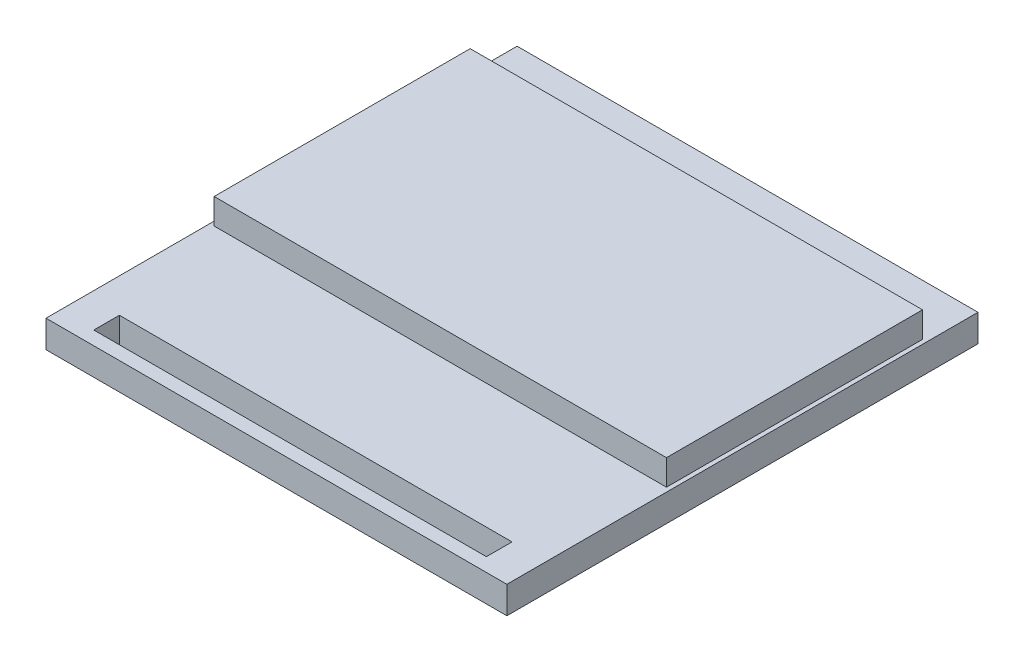
ISO-10303-21;
HEADER;
FILE_DESCRIPTION(('STEP AP214'),'2;1');
FILE_NAME('part.step','',(''),(''),'','','');
FILE_SCHEMA(('AUTOMOTIVE_DESIGN { 1 0 10303 214 1 1 1 1 }'));
ENDSEC;
DATA;
#1=APPLICATION_CONTEXT('core data for automotive mechanical design processes');
#2=APPLICATION_PROTOCOL_DEFINITION('international standard','automotive_design',2000,#1);
#3=PRODUCT_CONTEXT('',#1,'mechanical');
#4=PRODUCT('Part','Part','',(#3));
#5=PRODUCT_RELATED_PRODUCT_CATEGORY('part','',(#4));
#6=PRODUCT_DEFINITION_FORMATION('','',#4);
#7=PRODUCT_DEFINITION_CONTEXT('part definition',#1,'design');
#8=PRODUCT_DEFINITION('design','',#6,#7);
#9=PRODUCT_DEFINITION_SHAPE('','',#8);
#10=(LENGTH_UNIT() NAMED_UNIT(*) SI_UNIT(.MILLI.,.METRE.));
#11=(NAMED_UNIT(*) PLANE_ANGLE_UNIT() SI_UNIT($,.RADIAN.));
#12=(NAMED_UNIT(*) SI_UNIT($,.STERADIAN.) SOLID_ANGLE_UNIT());
#13=UNCERTAINTY_MEASURE_WITH_UNIT(LENGTH_MEASURE(1.E-05),#10,'distance_accuracy_value','');
#14=(GEOMETRIC_REPRESENTATION_CONTEXT(3) GLOBAL_UNCERTAINTY_ASSIGNED_CONTEXT((#13)) GLOBAL_UNIT_ASSIGNED_CONTEXT((#10,
#11,#12)) REPRESENTATION_CONTEXT('',''));
#15=CARTESIAN_POINT('',(0.,0.,0.));
#16=DIRECTION('',(0.,0.,1.));
#17=DIRECTION('',(1.,0.,0.));
#18=AXIS2_PLACEMENT_3D('',#15,#16,#17);
#19=CARTESIAN_POINT('',(0.,0.,0.));
#20=DIRECTION('',(0.,1.,0.));
#21=DIRECTION('',(0.,0.,1.));
#22=AXIS2_PLACEMENT_3D('',#19,#20,#21);
#23=PLANE('',#22);
#24=DIRECTION('',(0.,0.,-1.));
#25=VECTOR('',#24,1.);
#26=CARTESIAN_POINT('',(0.5,0.,0.6));
#27=LINE('',#26,#25);
#28=CARTESIAN_POINT('',(0.499999999999997,0.,13.2));
#29=VERTEX_POINT('',#28);
#30=CARTESIAN_POINT('',(0.5,0.,0.6));
#31=VERTEX_POINT('',#30);
#32=EDGE_CURVE('E191',#29,#31,#27,.T.);
#33=ORIENTED_EDGE('',*,*,#32,.F.);
#34=DIRECTION('',(-1.,0.,0.));
#35=VECTOR('',#34,1.);
#36=CARTESIAN_POINT('',(0.499999999999997,0.,13.2));
#37=LINE('',#36,#35);
#38=CARTESIAN_POINT('',(6.1,0.,13.2));
#39=VERTEX_POINT('',#38);
#40=EDGE_CURVE('E203',#39,#29,#37,.T.);
#41=ORIENTED_EDGE('',*,*,#40,.F.);
#42=DIRECTION('',(0.,0.,1.));
#43=VECTOR('',#42,1.);
#44=CARTESIAN_POINT('',(6.1,0.,0.6));
#45=LINE('',#44,#43);
#46=CARTESIAN_POINT('',(6.1,0.,0.6));
#47=VERTEX_POINT('',#46);
#48=EDGE_CURVE('E211',#47,#39,#45,.T.);
#49=ORIENTED_EDGE('',*,*,#48,.F.);
#50=DIRECTION('',(1.,0.,0.));
#51=VECTOR('',#50,1.);
#52=CARTESIAN_POINT('',(0.5,0.,0.6));
#53=LINE('',#52,#51);
#54=EDGE_CURVE('E56',#31,#47,#53,.T.);
#55=ORIENTED_EDGE('',*,*,#54,.F.);
#56=EDGE_LOOP('',(#33,#41,#49,#55));
#57=FACE_BOUND('',#56,.T.);
#58=DIRECTION('',(0.,0.,1.));
#59=VECTOR('',#58,1.);
#60=CARTESIAN_POINT('',(2.,0.,26.8));
#61=LINE('',#60,#59);
#62=CARTESIAN_POINT('',(2.,0.,25.3));
#63=VERTEX_POINT('',#62);
#64=CARTESIAN_POINT('',(2.,0.,26.8));
#65=VERTEX_POINT('',#64);
#66=EDGE_CURVE('E259',#63,#65,#61,.T.);
#67=ORIENTED_EDGE('',*,*,#66,.T.);
#68=DIRECTION('',(1.,0.,0.));
#69=VECTOR('',#68,1.);
#70=CARTESIAN_POINT('',(2.,0.,26.8));
#71=LINE('',#70,#69);
#72=CARTESIAN_POINT('',(25.,0.,26.8));
#73=VERTEX_POINT('',#72);
#74=EDGE_CURVE('E273',#65,#73,#71,.T.);
#75=ORIENTED_EDGE('',*,*,#74,.T.);
#76=DIRECTION('',(0.,0.,-1.));
#77=VECTOR('',#76,1.);
#78=CARTESIAN_POINT('',(25.,0.,26.8));
#79=LINE('',#78,#77);
#80=CARTESIAN_POINT('',(25.,0.,25.3));
#81=VERTEX_POINT('',#80);
#82=EDGE_CURVE('E276',#73,#81,#79,.T.);
#83=ORIENTED_EDGE('',*,*,#82,.T.);
#84=DIRECTION('',(-1.,0.,0.));
#85=VECTOR('',#84,1.);
#86=CARTESIAN_POINT('',(2.,0.,25.3));
#87=LINE('',#86,#85);
#88=EDGE_CURVE('E263',#81,#63,#87,.T.);
#89=ORIENTED_EDGE('',*,*,#88,.T.);
#90=EDGE_LOOP('',(#67,#75,#83,#89));
#91=FACE_BOUND('',#90,.T.);
#92=DIRECTION('',(0.,0.,-1.));
#93=VECTOR('',#92,1.);
#94=CARTESIAN_POINT('',(8.4,0.,0.));
#95=LINE('',#94,#93);
#96=CARTESIAN_POINT('',(8.4,0.,2.5));
#97=VERTEX_POINT('',#96);
#98=CARTESIAN_POINT('',(8.4,0.,0.));
#99=VERTEX_POINT('',#98);
#100=EDGE_CURVE('E48',#97,#99,#95,.T.);
#101=ORIENTED_EDGE('',*,*,#100,.F.);
#102=DIRECTION('',(-1.,0.,0.));
#103=VECTOR('',#102,1.);
#104=CARTESIAN_POINT('',(8.4,0.,2.5));
#105=LINE('',#104,#103);
#106=CARTESIAN_POINT('',(18.6,0.,2.5));
#107=VERTEX_POINT('',#106);
#108=EDGE_CURVE('E188',#107,#97,#105,.T.);
#109=ORIENTED_EDGE('',*,*,#108,.F.);
#110=DIRECTION('',(0.,0.,1.));
#111=VECTOR('',#110,1.);
#112=CARTESIAN_POINT('',(18.6,0.,0.));
#113=LINE('',#112,#111);
#114=CARTESIAN_POINT('',(18.6,0.,0.));
#115=VERTEX_POINT('',#114);
#116=EDGE_CURVE('E327',#115,#107,#113,.T.);
#117=ORIENTED_EDGE('',*,*,#116,.F.);
#118=DIRECTION('',(-1.,0.,0.));
#119=VECTOR('',#118,1.);
#120=CARTESIAN_POINT('',(0.,0.,0.));
#121=LINE('',#120,#119);
#122=CARTESIAN_POINT('',(27.,0.,0.));
#123=VERTEX_POINT('',#122);
#124=EDGE_CURVE('E295',#123,#115,#121,.T.);
#125=ORIENTED_EDGE('',*,*,#124,.F.);
#126=DIRECTION('',(0.,0.,-1.));
#127=VECTOR('',#126,1.);
#128=CARTESIAN_POINT('',(27.,0.,0.));
#129=LINE('',#128,#127);
#130=CARTESIAN_POINT('',(27.,0.,27.6));
#131=VERTEX_POINT('',#130);
#132=EDGE_CURVE('E306',#131,#123,#129,.T.);
#133=ORIENTED_EDGE('',*,*,#132,.F.);
#134=DIRECTION('',(1.,0.,0.));
#135=VECTOR('',#134,1.);
#136=CARTESIAN_POINT('',(0.,0.,27.6));
#137=LINE('',#136,#135);
#138=CARTESIAN_POINT('',(0.,0.,27.6));
#139=VERTEX_POINT('',#138);
#140=EDGE_CURVE('E304',#139,#131,#137,.T.);
#141=ORIENTED_EDGE('',*,*,#140,.F.);
#142=DIRECTION('',(0.,0.,1.));
#143=VECTOR('',#142,1.);
#144=CARTESIAN_POINT('',(0.,0.,0.));
#145=LINE('',#144,#143);
#146=CARTESIAN_POINT('',(0.,0.,0.));
#147=VERTEX_POINT('',#146);
#148=EDGE_CURVE('E290',#147,#139,#145,.T.);
#149=ORIENTED_EDGE('',*,*,#148,.F.);
#150=EDGE_CURVE('E308',#99,#147,#121,.T.);
#151=ORIENTED_EDGE('',*,*,#150,.F.);
#152=EDGE_LOOP('',(#101,#109,#117,#125,#133,#141,#149,#151));
#153=FACE_BOUND('',#152,.T.);
#154=ADVANCED_FACE('F33',(#57,#91,#153),#23,.F.);
#155=CARTESIAN_POINT('',(0.,1.6,0.));
#156=DIRECTION('',(0.,1.,0.));
#157=DIRECTION('',(0.,0.,1.));
#158=AXIS2_PLACEMENT_3D('',#155,#156,#157);
#159=PLANE('',#158);
#160=DIRECTION('',(0.,0.,1.));
#161=VECTOR('',#160,1.);
#162=CARTESIAN_POINT('',(0.25,1.6,3.));
#163=LINE('',#162,#161);
#164=CARTESIAN_POINT('',(0.25,1.6,3.));
#165=VERTEX_POINT('',#164);
#166=CARTESIAN_POINT('',(0.250000000000002,1.6,18.));
#167=VERTEX_POINT('',#166);
#168=EDGE_CURVE('E226',#165,#167,#163,.T.);
#169=ORIENTED_EDGE('',*,*,#168,.F.);
#170=DIRECTION('',(-1.,0.,0.));
#171=VECTOR('',#170,1.);
#172=CARTESIAN_POINT('',(0.25,1.6,3.));
#173=LINE('',#172,#171);
#174=CARTESIAN_POINT('',(26.75,1.6,3.));
#175=VERTEX_POINT('',#174);
#176=EDGE_CURVE('E231',#175,#165,#173,.T.);
#177=ORIENTED_EDGE('',*,*,#176,.F.);
#178=DIRECTION('',(0.,0.,-1.));
#179=VECTOR('',#178,1.);
#180=CARTESIAN_POINT('',(26.75,1.6,3.));
#181=LINE('',#180,#179);
#182=CARTESIAN_POINT('',(26.75,1.6,18.));
#183=VERTEX_POINT('',#182);
#184=EDGE_CURVE('E243',#183,#175,#181,.T.);
#185=ORIENTED_EDGE('',*,*,#184,.F.);
#186=DIRECTION('',(1.,0.,0.));
#187=VECTOR('',#186,1.);
#188=CARTESIAN_POINT('',(0.250000000000002,1.6,18.));
#189=LINE('',#188,#187);
#190=EDGE_CURVE('E240',#167,#183,#189,.T.);
#191=ORIENTED_EDGE('',*,*,#190,.F.);
#192=EDGE_LOOP('',(#169,#177,#185,#191));
#193=FACE_BOUND('',#192,.T.);
#194=DIRECTION('',(0.,0.,1.));
#195=VECTOR('',#194,1.);
#196=CARTESIAN_POINT('',(0.,1.6,0.));
#197=LINE('',#196,#195);
#198=CARTESIAN_POINT('',(0.,1.6,0.));
#199=VERTEX_POINT('',#198);
#200=CARTESIAN_POINT('',(0.,1.6,27.6));
#201=VERTEX_POINT('',#200);
#202=EDGE_CURVE('E291',#199,#201,#197,.T.);
#203=ORIENTED_EDGE('',*,*,#202,.T.);
#204=DIRECTION('',(1.,0.,0.));
#205=VECTOR('',#204,1.);
#206=CARTESIAN_POINT('',(0.,1.6,27.6));
#207=LINE('',#206,#205);
#208=CARTESIAN_POINT('',(27.,1.6,27.6));
#209=VERTEX_POINT('',#208);
#210=EDGE_CURVE('E294',#201,#209,#207,.T.);
#211=ORIENTED_EDGE('',*,*,#210,.T.);
#212=DIRECTION('',(0.,0.,-1.));
#213=VECTOR('',#212,1.);
#214=CARTESIAN_POINT('',(27.,1.6,0.));
#215=LINE('',#214,#213);
#216=CARTESIAN_POINT('',(27.,1.6,0.));
#217=VERTEX_POINT('',#216);
#218=EDGE_CURVE('E297',#209,#217,#215,.T.);
#219=ORIENTED_EDGE('',*,*,#218,.T.);
#220=DIRECTION('',(-1.,0.,0.));
#221=VECTOR('',#220,1.);
#222=CARTESIAN_POINT('',(0.,1.6,0.));
#223=LINE('',#222,#221);
#224=EDGE_CURVE('E299',#217,#199,#223,.T.);
#225=ORIENTED_EDGE('',*,*,#224,.T.);
#226=EDGE_LOOP('',(#203,#211,#219,#225));
#227=FACE_BOUND('',#226,.T.);
#228=DIRECTION('',(1.,0.,0.));
#229=VECTOR('',#228,1.);
#230=CARTESIAN_POINT('',(2.,1.6,26.8));
#231=LINE('',#230,#229);
#232=CARTESIAN_POINT('',(2.,1.6,26.8));
#233=VERTEX_POINT('',#232);
#234=CARTESIAN_POINT('',(25.,1.6,26.8));
#235=VERTEX_POINT('',#234);
#236=EDGE_CURVE('E262',#233,#235,#231,.T.);
#237=ORIENTED_EDGE('',*,*,#236,.F.);
#238=DIRECTION('',(0.,0.,1.));
#239=VECTOR('',#238,1.);
#240=CARTESIAN_POINT('',(2.,1.6,26.8));
#241=LINE('',#240,#239);
#242=CARTESIAN_POINT('',(2.,1.6,25.3));
#243=VERTEX_POINT('',#242);
#244=EDGE_CURVE('E260',#243,#233,#241,.T.);
#245=ORIENTED_EDGE('',*,*,#244,.F.);
#246=DIRECTION('',(-1.,0.,0.));
#247=VECTOR('',#246,1.);
#248=CARTESIAN_POINT('',(2.,1.6,25.3));
#249=LINE('',#248,#247);
#250=CARTESIAN_POINT('',(25.,1.6,25.3));
#251=VERTEX_POINT('',#250);
#252=EDGE_CURVE('E268',#251,#243,#249,.T.);
#253=ORIENTED_EDGE('',*,*,#252,.F.);
#254=DIRECTION('',(0.,0.,-1.));
#255=VECTOR('',#254,1.);
#256=CARTESIAN_POINT('',(25.,1.6,26.8));
#257=LINE('',#256,#255);
#258=EDGE_CURVE('E265',#235,#251,#257,.T.);
#259=ORIENTED_EDGE('',*,*,#258,.F.);
#260=EDGE_LOOP('',(#237,#245,#253,#259));
#261=FACE_BOUND('',#260,.T.);
#262=ADVANCED_FACE('F332',(#193,#227,#261),#159,.T.);
#263=CARTESIAN_POINT('',(0.,1.6,0.));
#264=DIRECTION('',(1.,0.,0.));
#265=DIRECTION('',(0.,0.,-1.));
#266=AXIS2_PLACEMENT_3D('',#263,#264,#265);
#267=PLANE('',#266);
#268=ORIENTED_EDGE('',*,*,#148,.T.);
#269=DIRECTION('',(0.,-1.,0.));
#270=VECTOR('',#269,1.);
#271=CARTESIAN_POINT('',(0.,1.6,27.6));
#272=LINE('',#271,#270);
#273=EDGE_CURVE('E11',#201,#139,#272,.T.);
#274=ORIENTED_EDGE('',*,*,#273,.F.);
#275=ORIENTED_EDGE('',*,*,#202,.F.);
#276=DIRECTION('',(0.,-1.,0.));
#277=VECTOR('',#276,1.);
#278=CARTESIAN_POINT('',(0.,1.6,0.));
#279=LINE('',#278,#277);
#280=EDGE_CURVE('E301',#199,#147,#279,.T.);
#281=ORIENTED_EDGE('',*,*,#280,.T.);
#282=EDGE_LOOP('',(#268,#274,#275,#281));
#283=FACE_BOUND('',#282,.T.);
#284=ADVANCED_FACE('F35',(#283),#267,.F.);
#285=CARTESIAN_POINT('',(0.,1.6,27.6));
#286=DIRECTION('',(0.,0.,-1.));
#287=DIRECTION('',(-1.,0.,0.));
#288=AXIS2_PLACEMENT_3D('',#285,#286,#287);
#289=PLANE('',#288);
#290=ORIENTED_EDGE('',*,*,#140,.T.);
#291=DIRECTION('',(0.,-1.,0.));
#292=VECTOR('',#291,1.);
#293=CARTESIAN_POINT('',(27.,1.6,27.6));
#294=LINE('',#293,#292);
#295=EDGE_CURVE('E41',#209,#131,#294,.T.);
#296=ORIENTED_EDGE('',*,*,#295,.F.);
#297=ORIENTED_EDGE('',*,*,#210,.F.);
#298=ORIENTED_EDGE('',*,*,#273,.T.);
#299=EDGE_LOOP('',(#290,#296,#297,#298));
#300=FACE_BOUND('',#299,.T.);
#301=ADVANCED_FACE('F335',(#300),#289,.F.);
#302=CARTESIAN_POINT('',(27.,1.6,0.));
#303=DIRECTION('',(-1.,0.,0.));
#304=DIRECTION('',(0.,0.,1.));
#305=AXIS2_PLACEMENT_3D('',#302,#303,#304);
#306=PLANE('',#305);
#307=ORIENTED_EDGE('',*,*,#132,.T.);
#308=DIRECTION('',(0.,-1.,0.));
#309=VECTOR('',#308,1.);
#310=CARTESIAN_POINT('',(27.,1.6,0.));
#311=LINE('',#310,#309);
#312=EDGE_CURVE('E312',#217,#123,#311,.T.);
#313=ORIENTED_EDGE('',*,*,#312,.F.);
#314=ORIENTED_EDGE('',*,*,#218,.F.);
#315=ORIENTED_EDGE('',*,*,#295,.T.);
#316=EDGE_LOOP('',(#307,#313,#314,#315));
#317=FACE_BOUND('',#316,.T.);
#318=ADVANCED_FACE('F319',(#317),#306,.F.);
#319=CARTESIAN_POINT('',(0.,1.6,0.));
#320=DIRECTION('',(0.,0.,1.));
#321=DIRECTION('',(1.,0.,0.));
#322=AXIS2_PLACEMENT_3D('',#319,#320,#321);
#323=PLANE('',#322);
#324=ORIENTED_EDGE('',*,*,#124,.T.);
#325=DIRECTION('',(0.,1.,0.));
#326=VECTOR('',#325,1.);
#327=CARTESIAN_POINT('',(18.6,-2.5,0.));
#328=LINE('',#327,#326);
#329=CARTESIAN_POINT('',(18.6,-2.5,0.));
#330=VERTEX_POINT('',#329);
#331=EDGE_CURVE('E177',#330,#115,#328,.T.);
#332=ORIENTED_EDGE('',*,*,#331,.F.);
#333=DIRECTION('',(1.,0.,0.));
#334=VECTOR('',#333,1.);
#335=CARTESIAN_POINT('',(8.4,-2.5,0.));
#336=LINE('',#335,#334);
#337=CARTESIAN_POINT('',(8.4,-2.5,0.));
#338=VERTEX_POINT('',#337);
#339=EDGE_CURVE('E171',#338,#330,#336,.T.);
#340=ORIENTED_EDGE('',*,*,#339,.F.);
#341=DIRECTION('',(0.,1.,0.));
#342=VECTOR('',#341,1.);
#343=CARTESIAN_POINT('',(8.4,-2.5,0.));
#344=LINE('',#343,#342);
#345=EDGE_CURVE('E175',#338,#99,#344,.T.);
#346=ORIENTED_EDGE('',*,*,#345,.T.);
#347=ORIENTED_EDGE('',*,*,#150,.T.);
#348=ORIENTED_EDGE('',*,*,#280,.F.);
#349=ORIENTED_EDGE('',*,*,#224,.F.);
#350=ORIENTED_EDGE('',*,*,#312,.T.);
#351=EDGE_LOOP('',(#324,#332,#340,#346,#347,#348,#349,#350));
#352=FACE_BOUND('',#351,.T.);
#353=ADVANCED_FACE('F174',(#352),#323,.F.);
#354=CARTESIAN_POINT('',(2.,1.6,26.8));
#355=DIRECTION('',(1.,0.,0.));
#356=DIRECTION('',(0.,0.,-1.));
#357=AXIS2_PLACEMENT_3D('',#354,#355,#356);
#358=PLANE('',#357);
#359=ORIENTED_EDGE('',*,*,#66,.F.);
#360=DIRECTION('',(0.,-1.,0.));
#361=VECTOR('',#360,1.);
#362=CARTESIAN_POINT('',(2.,1.6,25.3));
#363=LINE('',#362,#361);
#364=EDGE_CURVE('E270',#243,#63,#363,.T.);
#365=ORIENTED_EDGE('',*,*,#364,.F.);
#366=ORIENTED_EDGE('',*,*,#244,.T.);
#367=DIRECTION('',(0.,-1.,0.));
#368=VECTOR('',#367,1.);
#369=CARTESIAN_POINT('',(2.,1.6,26.8));
#370=LINE('',#369,#368);
#371=EDGE_CURVE('E287',#233,#65,#370,.T.);
#372=ORIENTED_EDGE('',*,*,#371,.T.);
#373=EDGE_LOOP('',(#359,#365,#366,#372));
#374=FACE_BOUND('',#373,.T.);
#375=ADVANCED_FACE('F371',(#374),#358,.T.);
#376=CARTESIAN_POINT('',(2.,1.6,26.8));
#377=DIRECTION('',(0.,0.,-1.));
#378=DIRECTION('',(-1.,0.,0.));
#379=AXIS2_PLACEMENT_3D('',#376,#377,#378);
#380=PLANE('',#379);
#381=ORIENTED_EDGE('',*,*,#74,.F.);
#382=ORIENTED_EDGE('',*,*,#371,.F.);
#383=ORIENTED_EDGE('',*,*,#236,.T.);
#384=DIRECTION('',(0.,-1.,0.));
#385=VECTOR('',#384,1.);
#386=CARTESIAN_POINT('',(25.,1.6,26.8));
#387=LINE('',#386,#385);
#388=EDGE_CURVE('E285',#235,#73,#387,.T.);
#389=ORIENTED_EDGE('',*,*,#388,.T.);
#390=EDGE_LOOP('',(#381,#382,#383,#389));
#391=FACE_BOUND('',#390,.T.);
#392=ADVANCED_FACE('F533',(#391),#380,.T.);
#393=CARTESIAN_POINT('',(25.,1.6,26.8));
#394=DIRECTION('',(-1.,0.,0.));
#395=DIRECTION('',(0.,0.,1.));
#396=AXIS2_PLACEMENT_3D('',#393,#394,#395);
#397=PLANE('',#396);
#398=ORIENTED_EDGE('',*,*,#82,.F.);
#399=ORIENTED_EDGE('',*,*,#388,.F.);
#400=ORIENTED_EDGE('',*,*,#258,.T.);
#401=DIRECTION('',(0.,-1.,0.));
#402=VECTOR('',#401,1.);
#403=CARTESIAN_POINT('',(25.,1.6,25.3));
#404=LINE('',#403,#402);
#405=EDGE_CURVE('E283',#251,#81,#404,.T.);
#406=ORIENTED_EDGE('',*,*,#405,.T.);
#407=EDGE_LOOP('',(#398,#399,#400,#406));
#408=FACE_BOUND('',#407,.T.);
#409=ADVANCED_FACE('F540',(#408),#397,.T.);
#410=CARTESIAN_POINT('',(2.,1.6,25.3));
#411=DIRECTION('',(0.,0.,1.));
#412=DIRECTION('',(1.,0.,0.));
#413=AXIS2_PLACEMENT_3D('',#410,#411,#412);
#414=PLANE('',#413);
#415=ORIENTED_EDGE('',*,*,#88,.F.);
#416=ORIENTED_EDGE('',*,*,#405,.F.);
#417=ORIENTED_EDGE('',*,*,#252,.T.);
#418=ORIENTED_EDGE('',*,*,#364,.T.);
#419=EDGE_LOOP('',(#415,#416,#417,#418));
#420=FACE_BOUND('',#419,.T.);
#421=ADVANCED_FACE('F389',(#420),#414,.T.);
#422=CARTESIAN_POINT('',(0.25,3.1,3.));
#423=DIRECTION('',(1.,0.,0.));
#424=DIRECTION('',(0.,0.,-1.));
#425=AXIS2_PLACEMENT_3D('',#422,#423,#424);
#426=PLANE('',#425);
#427=ORIENTED_EDGE('',*,*,#168,.T.);
#428=DIRECTION('',(0.,-1.,0.));
#429=VECTOR('',#428,1.);
#430=CARTESIAN_POINT('',(0.250000000000002,3.1,18.));
#431=LINE('',#430,#429);
#432=CARTESIAN_POINT('',(0.250000000000002,3.1,18.));
#433=VERTEX_POINT('',#432);
#434=EDGE_CURVE('E256',#433,#167,#431,.T.);
#435=ORIENTED_EDGE('',*,*,#434,.F.);
#436=DIRECTION('',(0.,0.,1.));
#437=VECTOR('',#436,1.);
#438=CARTESIAN_POINT('',(0.25,3.1,3.));
#439=LINE('',#438,#437);
#440=CARTESIAN_POINT('',(0.25,3.1,3.));
#441=VERTEX_POINT('',#440);
#442=EDGE_CURVE('E227',#441,#433,#439,.T.);
#443=ORIENTED_EDGE('',*,*,#442,.F.);
#444=DIRECTION('',(0.,-1.,0.));
#445=VECTOR('',#444,1.);
#446=CARTESIAN_POINT('',(0.25,3.1,3.));
#447=LINE('',#446,#445);
#448=EDGE_CURVE('E237',#441,#165,#447,.T.);
#449=ORIENTED_EDGE('',*,*,#448,.T.);
#450=EDGE_LOOP('',(#427,#435,#443,#449));
#451=FACE_BOUND('',#450,.T.);
#452=ADVANCED_FACE('F394',(#451),#426,.F.);
#453=CARTESIAN_POINT('',(0.250000000000002,3.1,18.));
#454=DIRECTION('',(0.,0.,-1.));
#455=DIRECTION('',(-1.,0.,0.));
#456=AXIS2_PLACEMENT_3D('',#453,#454,#455);
#457=PLANE('',#456);
#458=ORIENTED_EDGE('',*,*,#190,.T.);
#459=DIRECTION('',(0.,-1.,0.));
#460=VECTOR('',#459,1.);
#461=CARTESIAN_POINT('',(26.75,3.1,18.));
#462=LINE('',#461,#460);
#463=CARTESIAN_POINT('',(26.75,3.1,18.));
#464=VERTEX_POINT('',#463);
#465=EDGE_CURVE('E253',#464,#183,#462,.T.);
#466=ORIENTED_EDGE('',*,*,#465,.F.);
#467=DIRECTION('',(1.,0.,0.));
#468=VECTOR('',#467,1.);
#469=CARTESIAN_POINT('',(0.250000000000002,3.1,18.));
#470=LINE('',#469,#468);
#471=EDGE_CURVE('E230',#433,#464,#470,.T.);
#472=ORIENTED_EDGE('',*,*,#471,.F.);
#473=ORIENTED_EDGE('',*,*,#434,.T.);
#474=EDGE_LOOP('',(#458,#466,#472,#473));
#475=FACE_BOUND('',#474,.T.);
#476=ADVANCED_FACE('F399',(#475),#457,.F.);
#477=CARTESIAN_POINT('',(26.75,3.1,3.));
#478=DIRECTION('',(-1.,0.,0.));
#479=DIRECTION('',(0.,0.,1.));
#480=AXIS2_PLACEMENT_3D('',#477,#478,#479);
#481=PLANE('',#480);
#482=ORIENTED_EDGE('',*,*,#184,.T.);
#483=DIRECTION('',(0.,-1.,0.));
#484=VECTOR('',#483,1.);
#485=CARTESIAN_POINT('',(26.75,3.1,3.));
#486=LINE('',#485,#484);
#487=CARTESIAN_POINT('',(26.75,3.1,3.));
#488=VERTEX_POINT('',#487);
#489=EDGE_CURVE('E250',#488,#175,#486,.T.);
#490=ORIENTED_EDGE('',*,*,#489,.F.);
#491=DIRECTION('',(0.,0.,-1.));
#492=VECTOR('',#491,1.);
#493=CARTESIAN_POINT('',(26.75,3.1,3.));
#494=LINE('',#493,#492);
#495=EDGE_CURVE('E233',#464,#488,#494,.T.);
#496=ORIENTED_EDGE('',*,*,#495,.F.);
#497=ORIENTED_EDGE('',*,*,#465,.T.);
#498=EDGE_LOOP('',(#482,#490,#496,#497));
#499=FACE_BOUND('',#498,.T.);
#500=ADVANCED_FACE('F409',(#499),#481,.F.);
#501=CARTESIAN_POINT('',(0.25,3.1,3.));
#502=DIRECTION('',(0.,0.,1.));
#503=DIRECTION('',(1.,0.,0.));
#504=AXIS2_PLACEMENT_3D('',#501,#502,#503);
#505=PLANE('',#504);
#506=ORIENTED_EDGE('',*,*,#176,.T.);
#507=ORIENTED_EDGE('',*,*,#448,.F.);
#508=DIRECTION('',(-1.,0.,0.));
#509=VECTOR('',#508,1.);
#510=CARTESIAN_POINT('',(0.25,3.1,3.));
#511=LINE('',#510,#509);
#512=EDGE_CURVE('E235',#488,#441,#511,.T.);
#513=ORIENTED_EDGE('',*,*,#512,.F.);
#514=ORIENTED_EDGE('',*,*,#489,.T.);
#515=EDGE_LOOP('',(#506,#507,#513,#514));
#516=FACE_BOUND('',#515,.T.);
#517=ADVANCED_FACE('F419',(#516),#505,.F.);
#518=CARTESIAN_POINT('',(0.,3.1,0.));
#519=DIRECTION('',(0.,1.,0.));
#520=DIRECTION('',(0.,0.,1.));
#521=AXIS2_PLACEMENT_3D('',#518,#519,#520);
#522=PLANE('',#521);
#523=ORIENTED_EDGE('',*,*,#442,.T.);
#524=ORIENTED_EDGE('',*,*,#471,.T.);
#525=ORIENTED_EDGE('',*,*,#495,.T.);
#526=ORIENTED_EDGE('',*,*,#512,.T.);
#527=EDGE_LOOP('',(#523,#524,#525,#526));
#528=FACE_BOUND('',#527,.T.);
#529=ADVANCED_FACE('F429',(#528),#522,.T.);
#530=CARTESIAN_POINT('',(0.5,-2.,0.6));
#531=DIRECTION('',(1.,0.,0.));
#532=DIRECTION('',(0.,0.,-1.));
#533=AXIS2_PLACEMENT_3D('',#530,#531,#532);
#534=PLANE('',#533);
#535=ORIENTED_EDGE('',*,*,#32,.T.);
#536=DIRECTION('',(0.,1.,0.));
#537=VECTOR('',#536,1.);
#538=CARTESIAN_POINT('',(0.5,-2.,0.6));
#539=LINE('',#538,#537);
#540=CARTESIAN_POINT('',(0.5,-2.,0.6));
#541=VERTEX_POINT('',#540);
#542=EDGE_CURVE('E224',#541,#31,#539,.T.);
#543=ORIENTED_EDGE('',*,*,#542,.F.);
#544=DIRECTION('',(0.,0.,-1.));
#545=VECTOR('',#544,1.);
#546=CARTESIAN_POINT('',(0.5,-2.,0.6));
#547=LINE('',#546,#545);
#548=CARTESIAN_POINT('',(0.499999999999997,-2.,13.2));
#549=VERTEX_POINT('',#548);
#550=EDGE_CURVE('E199',#549,#541,#547,.T.);
#551=ORIENTED_EDGE('',*,*,#550,.F.);
#552=DIRECTION('',(0.,1.,0.));
#553=VECTOR('',#552,1.);
#554=CARTESIAN_POINT('',(0.499999999999997,-2.,13.2));
#555=LINE('',#554,#553);
#556=EDGE_CURVE('E208',#549,#29,#555,.T.);
#557=ORIENTED_EDGE('',*,*,#556,.T.);
#558=EDGE_LOOP('',(#535,#543,#551,#557));
#559=FACE_BOUND('',#558,.T.);
#560=ADVANCED_FACE('F439',(#559),#534,.F.);
#561=CARTESIAN_POINT('',(0.5,-2.,0.6));
#562=DIRECTION('',(0.,0.,1.));
#563=DIRECTION('',(1.,0.,0.));
#564=AXIS2_PLACEMENT_3D('',#561,#562,#563);
#565=PLANE('',#564);
#566=ORIENTED_EDGE('',*,*,#54,.T.);
#567=DIRECTION('',(0.,1.,0.));
#568=VECTOR('',#567,1.);
#569=CARTESIAN_POINT('',(6.1,-2.,0.6));
#570=LINE('',#569,#568);
#571=CARTESIAN_POINT('',(6.1,-2.,0.6));
#572=VERTEX_POINT('',#571);
#573=EDGE_CURVE('E221',#572,#47,#570,.T.);
#574=ORIENTED_EDGE('',*,*,#573,.F.);
#575=DIRECTION('',(1.,0.,0.));
#576=VECTOR('',#575,1.);
#577=CARTESIAN_POINT('',(0.5,-2.,0.6));
#578=LINE('',#577,#576);
#579=EDGE_CURVE('E202',#541,#572,#578,.T.);
#580=ORIENTED_EDGE('',*,*,#579,.F.);
#581=ORIENTED_EDGE('',*,*,#542,.T.);
#582=EDGE_LOOP('',(#566,#574,#580,#581));
#583=FACE_BOUND('',#582,.T.);
#584=ADVANCED_FACE('F449',(#583),#565,.F.);
#585=CARTESIAN_POINT('',(6.1,-2.,0.6));
#586=DIRECTION('',(-1.,0.,0.));
#587=DIRECTION('',(0.,0.,1.));
#588=AXIS2_PLACEMENT_3D('',#585,#586,#587);
#589=PLANE('',#588);
#590=ORIENTED_EDGE('',*,*,#48,.T.);
#591=DIRECTION('',(0.,1.,0.));
#592=VECTOR('',#591,1.);
#593=CARTESIAN_POINT('',(6.1,-2.,13.2));
#594=LINE('',#593,#592);
#595=CARTESIAN_POINT('',(6.1,-2.,13.2));
#596=VERTEX_POINT('',#595);
#597=EDGE_CURVE('E218',#596,#39,#594,.T.);
#598=ORIENTED_EDGE('',*,*,#597,.F.);
#599=DIRECTION('',(0.,0.,1.));
#600=VECTOR('',#599,1.);
#601=CARTESIAN_POINT('',(6.1,-2.,0.6));
#602=LINE('',#601,#600);
#603=EDGE_CURVE('E205',#572,#596,#602,.T.);
#604=ORIENTED_EDGE('',*,*,#603,.F.);
#605=ORIENTED_EDGE('',*,*,#573,.T.);
#606=EDGE_LOOP('',(#590,#598,#604,#605));
#607=FACE_BOUND('',#606,.T.);
#608=ADVANCED_FACE('F459',(#607),#589,.F.);
#609=CARTESIAN_POINT('',(0.499999999999997,-2.,13.2));
#610=DIRECTION('',(0.,0.,-1.));
#611=DIRECTION('',(-1.,0.,0.));
#612=AXIS2_PLACEMENT_3D('',#609,#610,#611);
#613=PLANE('',#612);
#614=ORIENTED_EDGE('',*,*,#40,.T.);
#615=ORIENTED_EDGE('',*,*,#556,.F.);
#616=DIRECTION('',(-1.,0.,0.));
#617=VECTOR('',#616,1.);
#618=CARTESIAN_POINT('',(0.499999999999997,-2.,13.2));
#619=LINE('',#618,#617);
#620=EDGE_CURVE('E207',#596,#549,#619,.T.);
#621=ORIENTED_EDGE('',*,*,#620,.F.);
#622=ORIENTED_EDGE('',*,*,#597,.T.);
#623=EDGE_LOOP('',(#614,#615,#621,#622));
#624=FACE_BOUND('',#623,.T.);
#625=ADVANCED_FACE('F469',(#624),#613,.F.);
#626=CARTESIAN_POINT('',(0.,-2.,0.));
#627=DIRECTION('',(0.,1.,0.));
#628=DIRECTION('',(0.,0.,1.));
#629=AXIS2_PLACEMENT_3D('',#626,#627,#628);
#630=PLANE('',#629);
#631=ORIENTED_EDGE('',*,*,#550,.T.);
#632=ORIENTED_EDGE('',*,*,#579,.T.);
#633=ORIENTED_EDGE('',*,*,#603,.T.);
#634=ORIENTED_EDGE('',*,*,#620,.T.);
#635=EDGE_LOOP('',(#631,#632,#633,#634));
#636=FACE_BOUND('',#635,.T.);
#637=ADVANCED_FACE('F357',(#636),#630,.F.);
#638=CARTESIAN_POINT('',(8.4,-2.5,0.));
#639=DIRECTION('',(1.,0.,0.));
#640=DIRECTION('',(0.,0.,-1.));
#641=AXIS2_PLACEMENT_3D('',#638,#639,#640);
#642=PLANE('',#641);
#643=ORIENTED_EDGE('',*,*,#100,.T.);
#644=ORIENTED_EDGE('',*,*,#345,.F.);
#645=DIRECTION('',(0.,0.,-1.));
#646=VECTOR('',#645,1.);
#647=CARTESIAN_POINT('',(8.4,-2.5,0.));
#648=LINE('',#647,#646);
#649=CARTESIAN_POINT('',(8.4,-2.5,2.5));
#650=VERTEX_POINT('',#649);
#651=EDGE_CURVE('E181',#650,#338,#648,.T.);
#652=ORIENTED_EDGE('',*,*,#651,.F.);
#653=DIRECTION('',(0.,1.,0.));
#654=VECTOR('',#653,1.);
#655=CARTESIAN_POINT('',(8.4,-2.5,2.5));
#656=LINE('',#655,#654);
#657=EDGE_CURVE('E343',#650,#97,#656,.T.);
#658=ORIENTED_EDGE('',*,*,#657,.T.);
#659=EDGE_LOOP('',(#643,#644,#652,#658));
#660=FACE_BOUND('',#659,.T.);
#661=ADVANCED_FACE('F190',(#660),#642,.F.);
#662=CARTESIAN_POINT('',(18.6,-2.5,0.));
#663=DIRECTION('',(-1.,0.,0.));
#664=DIRECTION('',(0.,0.,1.));
#665=AXIS2_PLACEMENT_3D('',#662,#663,#664);
#666=PLANE('',#665);
#667=ORIENTED_EDGE('',*,*,#116,.T.);
#668=DIRECTION('',(0.,1.,0.));
#669=VECTOR('',#668,1.);
#670=CARTESIAN_POINT('',(18.6,-2.5,2.5));
#671=LINE('',#670,#669);
#672=CARTESIAN_POINT('',(18.6,-2.5,2.5));
#673=VERTEX_POINT('',#672);
#674=EDGE_CURVE('E195',#673,#107,#671,.T.);
#675=ORIENTED_EDGE('',*,*,#674,.F.);
#676=DIRECTION('',(0.,0.,1.));
#677=VECTOR('',#676,1.);
#678=CARTESIAN_POINT('',(18.6,-2.5,0.));
#679=LINE('',#678,#677);
#680=EDGE_CURVE('E180',#330,#673,#679,.T.);
#681=ORIENTED_EDGE('',*,*,#680,.F.);
#682=ORIENTED_EDGE('',*,*,#331,.T.);
#683=EDGE_LOOP('',(#667,#675,#681,#682));
#684=FACE_BOUND('',#683,.T.);
#685=ADVANCED_FACE('F349',(#684),#666,.F.);
#686=CARTESIAN_POINT('',(8.4,-2.5,2.5));
#687=DIRECTION('',(0.,0.,-1.));
#688=DIRECTION('',(-1.,0.,0.));
#689=AXIS2_PLACEMENT_3D('',#686,#687,#688);
#690=PLANE('',#689);
#691=ORIENTED_EDGE('',*,*,#108,.T.);
#692=ORIENTED_EDGE('',*,*,#657,.F.);
#693=DIRECTION('',(-1.,0.,0.));
#694=VECTOR('',#693,1.);
#695=CARTESIAN_POINT('',(8.4,-2.5,2.5));
#696=LINE('',#695,#694);
#697=EDGE_CURVE('E186',#673,#650,#696,.T.);
#698=ORIENTED_EDGE('',*,*,#697,.F.);
#699=ORIENTED_EDGE('',*,*,#674,.T.);
#700=EDGE_LOOP('',(#691,#692,#698,#699));
#701=FACE_BOUND('',#700,.T.);
#702=ADVANCED_FACE('F347',(#701),#690,.F.);
#703=CARTESIAN_POINT('',(0.,-2.5,0.));
#704=DIRECTION('',(0.,1.,0.));
#705=DIRECTION('',(0.,0.,1.));
#706=AXIS2_PLACEMENT_3D('',#703,#704,#705);
#707=PLANE('',#706);
#708=ORIENTED_EDGE('',*,*,#651,.T.);
#709=ORIENTED_EDGE('',*,*,#339,.T.);
#710=ORIENTED_EDGE('',*,*,#680,.T.);
#711=ORIENTED_EDGE('',*,*,#697,.T.);
#712=EDGE_LOOP('',(#708,#709,#710,#711));
#713=FACE_BOUND('',#712,.T.);
#714=ADVANCED_FACE('F184',(#713),#707,.F.);
#715=CLOSED_SHELL('',(#154,#262,#284,#301,#318,#353,#375,#392,#409,#421,#452,#476,#500,#517,
#529,#560,#584,#608,#625,#637,#661,#685,#702,#714));
#716=MANIFOLD_SOLID_BREP('B2',#715);
#717=ADVANCED_BREP_SHAPE_REPRESENTATION('',(#18,#716),#14);
#718=SHAPE_DEFINITION_REPRESENTATION(#9,#717);
ENDSEC;
END-ISO-10303-21;
